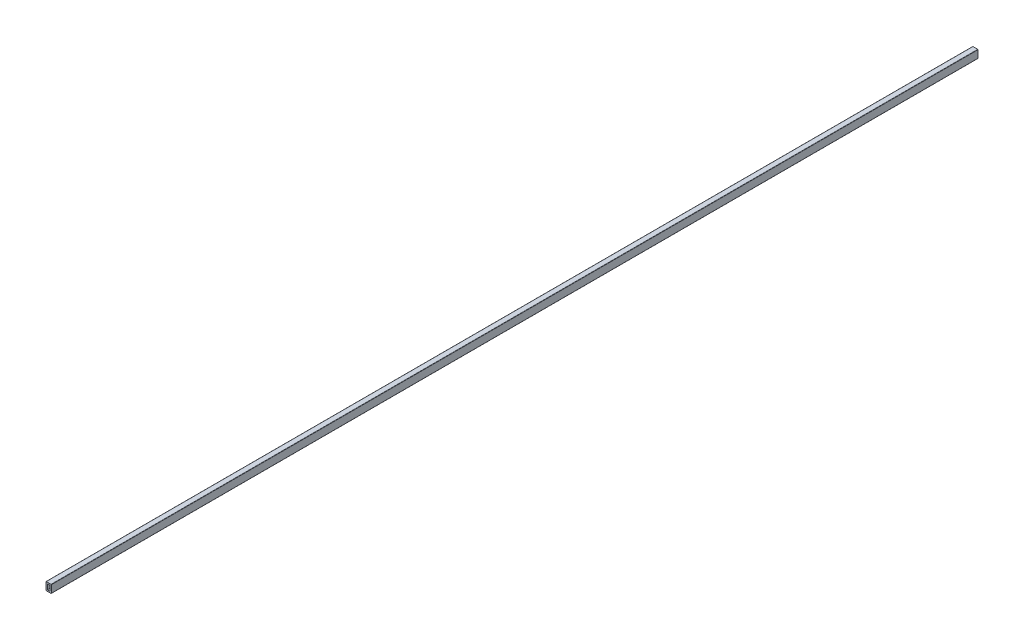
ISO-10303-21;
HEADER;
FILE_DESCRIPTION(('STEP AP214'),'2;1');
FILE_NAME('part.step','',(''),(''),'','','');
FILE_SCHEMA(('AUTOMOTIVE_DESIGN { 1 0 10303 214 1 1 1 1 }'));
ENDSEC;
DATA;
#1=APPLICATION_CONTEXT('core data for automotive mechanical design processes');
#2=APPLICATION_PROTOCOL_DEFINITION('international standard','automotive_design',2000,#1);
#3=PRODUCT_CONTEXT('',#1,'mechanical');
#4=PRODUCT('Part','Part','',(#3));
#5=PRODUCT_RELATED_PRODUCT_CATEGORY('part','',(#4));
#6=PRODUCT_DEFINITION_FORMATION('','',#4);
#7=PRODUCT_DEFINITION_CONTEXT('part definition',#1,'design');
#8=PRODUCT_DEFINITION('design','',#6,#7);
#9=PRODUCT_DEFINITION_SHAPE('','',#8);
#10=(LENGTH_UNIT() NAMED_UNIT(*) SI_UNIT(.MILLI.,.METRE.));
#11=(NAMED_UNIT(*) PLANE_ANGLE_UNIT() SI_UNIT($,.RADIAN.));
#12=(NAMED_UNIT(*) SI_UNIT($,.STERADIAN.) SOLID_ANGLE_UNIT());
#13=UNCERTAINTY_MEASURE_WITH_UNIT(LENGTH_MEASURE(1.E-05),#10,'distance_accuracy_value','');
#14=(GEOMETRIC_REPRESENTATION_CONTEXT(3) GLOBAL_UNCERTAINTY_ASSIGNED_CONTEXT((#13)) GLOBAL_UNIT_ASSIGNED_CONTEXT((#10,
#11,#12)) REPRESENTATION_CONTEXT('',''));
#15=CARTESIAN_POINT('',(0.,0.,0.));
#16=DIRECTION('',(0.,0.,1.));
#17=DIRECTION('',(1.,0.,0.));
#18=AXIS2_PLACEMENT_3D('',#15,#16,#17);
#19=CARTESIAN_POINT('',(0.9,-1.4,0.));
#20=DIRECTION('',(0.,0.,1.));
#21=DIRECTION('',(1.,0.,0.));
#22=AXIS2_PLACEMENT_3D('',#19,#20,#21);
#23=CYLINDRICAL_SURFACE('',#22,0.1);
#24=DIRECTION('',(0.,0.,-1.));
#25=VECTOR('',#24,1.);
#26=CARTESIAN_POINT('',(0.9,-1.5,0.));
#27=LINE('',#26,#25);
#28=CARTESIAN_POINT('',(0.9,-1.5,350.));
#29=VERTEX_POINT('',#28);
#30=CARTESIAN_POINT('',(0.9,-1.5,0.));
#31=VERTEX_POINT('',#30);
#32=EDGE_CURVE('E115',#29,#31,#27,.T.);
#33=ORIENTED_EDGE('',*,*,#32,.T.);
#34=CARTESIAN_POINT('',(0.9,-1.4,0.));
#35=DIRECTION('',(0.,0.,1.));
#36=DIRECTION('',(1.,0.,0.));
#37=AXIS2_PLACEMENT_3D('',#34,#35,#36);
#38=CIRCLE('',#37,0.1);
#39=CARTESIAN_POINT('',(1.,-1.4,0.));
#40=VERTEX_POINT('',#39);
#41=EDGE_CURVE('E20',#40,#31,#38,.F.);
#42=ORIENTED_EDGE('',*,*,#41,.F.);
#43=DIRECTION('',(0.,0.,-1.));
#44=VECTOR('',#43,1.);
#45=CARTESIAN_POINT('',(1.,-1.4,0.));
#46=LINE('',#45,#44);
#47=CARTESIAN_POINT('',(1.,-1.4,350.));
#48=VERTEX_POINT('',#47);
#49=EDGE_CURVE('E120',#40,#48,#46,.F.);
#50=ORIENTED_EDGE('',*,*,#49,.T.);
#51=CARTESIAN_POINT('',(0.9,-1.4,350.));
#52=DIRECTION('',(0.,0.,1.));
#53=DIRECTION('',(1.,0.,0.));
#54=AXIS2_PLACEMENT_3D('',#51,#52,#53);
#55=CIRCLE('',#54,0.1);
#56=EDGE_CURVE('E113',#29,#48,#55,.T.);
#57=ORIENTED_EDGE('',*,*,#56,.F.);
#58=EDGE_LOOP('',(#33,#42,#50,#57));
#59=FACE_BOUND('',#58,.T.);
#60=ADVANCED_FACE('F17',(#59),#23,.T.);
#61=CARTESIAN_POINT('',(-0.9,-1.4,0.));
#62=DIRECTION('',(0.,0.,1.));
#63=DIRECTION('',(1.,0.,0.));
#64=AXIS2_PLACEMENT_3D('',#61,#62,#63);
#65=CYLINDRICAL_SURFACE('',#64,0.0999999999999999);
#66=DIRECTION('',(0.,0.,1.));
#67=VECTOR('',#66,1.);
#68=CARTESIAN_POINT('',(-1.,-1.4,0.));
#69=LINE('',#68,#67);
#70=CARTESIAN_POINT('',(-1.,-1.4,350.));
#71=VERTEX_POINT('',#70);
#72=CARTESIAN_POINT('',(-1.,-1.4,0.));
#73=VERTEX_POINT('',#72);
#74=EDGE_CURVE('E144',#71,#73,#69,.F.);
#75=ORIENTED_EDGE('',*,*,#74,.T.);
#76=CARTESIAN_POINT('',(-0.9,-1.4,0.));
#77=DIRECTION('',(0.,0.,1.));
#78=DIRECTION('',(1.,0.,0.));
#79=AXIS2_PLACEMENT_3D('',#76,#77,#78);
#80=CIRCLE('',#79,0.0999999999999999);
#81=CARTESIAN_POINT('',(-0.9,-1.5,0.));
#82=VERTEX_POINT('',#81);
#83=EDGE_CURVE('E165',#82,#73,#80,.F.);
#84=ORIENTED_EDGE('',*,*,#83,.F.);
#85=DIRECTION('',(0.,0.,-1.));
#86=VECTOR('',#85,1.);
#87=CARTESIAN_POINT('',(-0.9,-1.5,0.));
#88=LINE('',#87,#86);
#89=CARTESIAN_POINT('',(-0.9,-1.5,350.));
#90=VERTEX_POINT('',#89);
#91=EDGE_CURVE('E119',#82,#90,#88,.F.);
#92=ORIENTED_EDGE('',*,*,#91,.T.);
#93=CARTESIAN_POINT('',(-0.9,-1.4,350.));
#94=DIRECTION('',(0.,0.,1.));
#95=DIRECTION('',(1.,0.,0.));
#96=AXIS2_PLACEMENT_3D('',#93,#94,#95);
#97=CIRCLE('',#96,0.0999999999999999);
#98=EDGE_CURVE('E163',#71,#90,#97,.T.);
#99=ORIENTED_EDGE('',*,*,#98,.F.);
#100=EDGE_LOOP('',(#75,#84,#92,#99));
#101=FACE_BOUND('',#100,.T.);
#102=ADVANCED_FACE('F227',(#101),#65,.T.);
#103=CARTESIAN_POINT('',(0.9,1.4,0.));
#104=DIRECTION('',(0.,0.,1.));
#105=DIRECTION('',(1.,0.,0.));
#106=AXIS2_PLACEMENT_3D('',#103,#104,#105);
#107=CYLINDRICAL_SURFACE('',#106,0.0999999999999999);
#108=DIRECTION('',(0.,0.,-1.));
#109=VECTOR('',#108,1.);
#110=CARTESIAN_POINT('',(1.,1.4,0.));
#111=LINE('',#110,#109);
#112=CARTESIAN_POINT('',(1.,1.4,350.));
#113=VERTEX_POINT('',#112);
#114=CARTESIAN_POINT('',(1.,1.4,0.));
#115=VERTEX_POINT('',#114);
#116=EDGE_CURVE('E151',#113,#115,#111,.T.);
#117=ORIENTED_EDGE('',*,*,#116,.T.);
#118=CARTESIAN_POINT('',(0.9,1.4,0.));
#119=DIRECTION('',(0.,0.,1.));
#120=DIRECTION('',(1.,0.,0.));
#121=AXIS2_PLACEMENT_3D('',#118,#119,#120);
#122=CIRCLE('',#121,0.0999999999999999);
#123=CARTESIAN_POINT('',(0.9,1.5,0.));
#124=VERTEX_POINT('',#123);
#125=EDGE_CURVE('E161',#124,#115,#122,.F.);
#126=ORIENTED_EDGE('',*,*,#125,.F.);
#127=DIRECTION('',(0.,0.,1.));
#128=VECTOR('',#127,1.);
#129=CARTESIAN_POINT('',(0.9,1.5,0.));
#130=LINE('',#129,#128);
#131=CARTESIAN_POINT('',(0.9,1.5,350.));
#132=VERTEX_POINT('',#131);
#133=EDGE_CURVE('E141',#124,#132,#130,.T.);
#134=ORIENTED_EDGE('',*,*,#133,.T.);
#135=CARTESIAN_POINT('',(0.9,1.4,350.));
#136=DIRECTION('',(0.,0.,1.));
#137=DIRECTION('',(1.,0.,0.));
#138=AXIS2_PLACEMENT_3D('',#135,#136,#137);
#139=CIRCLE('',#138,0.0999999999999999);
#140=EDGE_CURVE('E159',#113,#132,#139,.T.);
#141=ORIENTED_EDGE('',*,*,#140,.F.);
#142=EDGE_LOOP('',(#117,#126,#134,#141));
#143=FACE_BOUND('',#142,.T.);
#144=ADVANCED_FACE('F229',(#143),#107,.T.);
#145=CARTESIAN_POINT('',(-0.9,1.4,0.));
#146=DIRECTION('',(0.,0.,1.));
#147=DIRECTION('',(1.,0.,0.));
#148=AXIS2_PLACEMENT_3D('',#145,#146,#147);
#149=CYLINDRICAL_SURFACE('',#148,0.1);
#150=DIRECTION('',(0.,0.,1.));
#151=VECTOR('',#150,1.);
#152=CARTESIAN_POINT('',(-0.9,1.5,0.));
#153=LINE('',#152,#151);
#154=CARTESIAN_POINT('',(-0.9,1.5,350.));
#155=VERTEX_POINT('',#154);
#156=CARTESIAN_POINT('',(-0.9,1.5,0.));
#157=VERTEX_POINT('',#156);
#158=EDGE_CURVE('E138',#155,#157,#153,.F.);
#159=ORIENTED_EDGE('',*,*,#158,.T.);
#160=CARTESIAN_POINT('',(-0.9,1.4,0.));
#161=DIRECTION('',(0.,0.,1.));
#162=DIRECTION('',(1.,0.,0.));
#163=AXIS2_PLACEMENT_3D('',#160,#161,#162);
#164=CIRCLE('',#163,0.1);
#165=CARTESIAN_POINT('',(-1.,1.4,0.));
#166=VERTEX_POINT('',#165);
#167=EDGE_CURVE('E157',#166,#157,#164,.F.);
#168=ORIENTED_EDGE('',*,*,#167,.F.);
#169=DIRECTION('',(0.,0.,1.));
#170=VECTOR('',#169,1.);
#171=CARTESIAN_POINT('',(-1.,1.4,0.));
#172=LINE('',#171,#170);
#173=CARTESIAN_POINT('',(-1.,1.4,350.));
#174=VERTEX_POINT('',#173);
#175=EDGE_CURVE('E147',#166,#174,#172,.T.);
#176=ORIENTED_EDGE('',*,*,#175,.T.);
#177=CARTESIAN_POINT('',(-0.9,1.4,350.));
#178=DIRECTION('',(0.,0.,1.));
#179=DIRECTION('',(1.,0.,0.));
#180=AXIS2_PLACEMENT_3D('',#177,#178,#179);
#181=CIRCLE('',#180,0.1);
#182=EDGE_CURVE('E154',#155,#174,#181,.T.);
#183=ORIENTED_EDGE('',*,*,#182,.F.);
#184=EDGE_LOOP('',(#159,#168,#176,#183));
#185=FACE_BOUND('',#184,.T.);
#186=ADVANCED_FACE('F224',(#185),#149,.T.);
#187=CARTESIAN_POINT('',(1.,0.,0.));
#188=DIRECTION('',(1.,0.,0.));
#189=DIRECTION('',(0.,0.,-1.));
#190=AXIS2_PLACEMENT_3D('',#187,#188,#189);
#191=PLANE('',#190);
#192=ORIENTED_EDGE('',*,*,#49,.F.);
#193=DIRECTION('',(0.,1.,0.));
#194=VECTOR('',#193,1.);
#195=CARTESIAN_POINT('',(1.,0.,0.));
#196=LINE('',#195,#194);
#197=EDGE_CURVE('E112',#40,#115,#196,.T.);
#198=ORIENTED_EDGE('',*,*,#197,.T.);
#199=ORIENTED_EDGE('',*,*,#116,.F.);
#200=DIRECTION('',(0.,1.,0.));
#201=VECTOR('',#200,1.);
#202=CARTESIAN_POINT('',(1.,0.,350.));
#203=LINE('',#202,#201);
#204=EDGE_CURVE('E170',#113,#48,#203,.F.);
#205=ORIENTED_EDGE('',*,*,#204,.T.);
#206=EDGE_LOOP('',(#192,#198,#199,#205));
#207=FACE_BOUND('',#206,.T.);
#208=ADVANCED_FACE('F174',(#207),#191,.T.);
#209=CARTESIAN_POINT('',(0.,-1.5,0.));
#210=DIRECTION('',(0.,-1.,0.));
#211=DIRECTION('',(0.,0.,-1.));
#212=AXIS2_PLACEMENT_3D('',#209,#210,#211);
#213=PLANE('',#212);
#214=ORIENTED_EDGE('',*,*,#91,.F.);
#215=DIRECTION('',(1.,0.,0.));
#216=VECTOR('',#215,1.);
#217=CARTESIAN_POINT('',(0.,-1.5,0.));
#218=LINE('',#217,#216);
#219=EDGE_CURVE('E110',#82,#31,#218,.T.);
#220=ORIENTED_EDGE('',*,*,#219,.T.);
#221=ORIENTED_EDGE('',*,*,#32,.F.);
#222=DIRECTION('',(1.,0.,0.));
#223=VECTOR('',#222,1.);
#224=CARTESIAN_POINT('',(0.,-1.5,350.));
#225=LINE('',#224,#223);
#226=EDGE_CURVE('E171',#29,#90,#225,.F.);
#227=ORIENTED_EDGE('',*,*,#226,.T.);
#228=EDGE_LOOP('',(#214,#220,#221,#227));
#229=FACE_BOUND('',#228,.T.);
#230=ADVANCED_FACE('F123',(#229),#213,.T.);
#231=CARTESIAN_POINT('',(-1.,0.,0.));
#232=DIRECTION('',(-1.,0.,0.));
#233=DIRECTION('',(0.,0.,1.));
#234=AXIS2_PLACEMENT_3D('',#231,#232,#233);
#235=PLANE('',#234);
#236=ORIENTED_EDGE('',*,*,#74,.F.);
#237=DIRECTION('',(0.,1.,0.));
#238=VECTOR('',#237,1.);
#239=CARTESIAN_POINT('',(-1.,0.,350.));
#240=LINE('',#239,#238);
#241=EDGE_CURVE('E177',#71,#174,#240,.T.);
#242=ORIENTED_EDGE('',*,*,#241,.T.);
#243=ORIENTED_EDGE('',*,*,#175,.F.);
#244=DIRECTION('',(0.,1.,0.));
#245=VECTOR('',#244,1.);
#246=CARTESIAN_POINT('',(-1.,0.,0.));
#247=LINE('',#246,#245);
#248=EDGE_CURVE('E125',#166,#73,#247,.F.);
#249=ORIENTED_EDGE('',*,*,#248,.T.);
#250=EDGE_LOOP('',(#236,#242,#243,#249));
#251=FACE_BOUND('',#250,.T.);
#252=ADVANCED_FACE('F219',(#251),#235,.T.);
#253=CARTESIAN_POINT('',(0.,1.5,0.));
#254=DIRECTION('',(0.,1.,0.));
#255=DIRECTION('',(0.,0.,1.));
#256=AXIS2_PLACEMENT_3D('',#253,#254,#255);
#257=PLANE('',#256);
#258=ORIENTED_EDGE('',*,*,#158,.F.);
#259=DIRECTION('',(1.,0.,0.));
#260=VECTOR('',#259,1.);
#261=CARTESIAN_POINT('',(0.,1.5,350.));
#262=LINE('',#261,#260);
#263=EDGE_CURVE('E212',#155,#132,#262,.T.);
#264=ORIENTED_EDGE('',*,*,#263,.T.);
#265=ORIENTED_EDGE('',*,*,#133,.F.);
#266=DIRECTION('',(1.,0.,0.));
#267=VECTOR('',#266,1.);
#268=CARTESIAN_POINT('',(0.,1.5,0.));
#269=LINE('',#268,#267);
#270=EDGE_CURVE('E130',#124,#157,#269,.F.);
#271=ORIENTED_EDGE('',*,*,#270,.T.);
#272=EDGE_LOOP('',(#258,#264,#265,#271));
#273=FACE_BOUND('',#272,.T.);
#274=ADVANCED_FACE('F255',(#273),#257,.T.);
#275=CARTESIAN_POINT('',(0.5,0.,0.));
#276=DIRECTION('',(1.,0.,0.));
#277=DIRECTION('',(0.,0.,-1.));
#278=AXIS2_PLACEMENT_3D('',#275,#276,#277);
#279=PLANE('',#278);
#280=DIRECTION('',(0.,0.,1.));
#281=VECTOR('',#280,1.);
#282=CARTESIAN_POINT('',(0.5,1.,0.));
#283=LINE('',#282,#281);
#284=CARTESIAN_POINT('',(0.5,1.,350.));
#285=VERTEX_POINT('',#284);
#286=CARTESIAN_POINT('',(0.5,1.,0.));
#287=VERTEX_POINT('',#286);
#288=EDGE_CURVE('E136',#285,#287,#283,.F.);
#289=ORIENTED_EDGE('',*,*,#288,.T.);
#290=DIRECTION('',(0.,1.,0.));
#291=VECTOR('',#290,1.);
#292=CARTESIAN_POINT('',(0.5,0.,0.));
#293=LINE('',#292,#291);
#294=CARTESIAN_POINT('',(0.5,-1.,0.));
#295=VERTEX_POINT('',#294);
#296=EDGE_CURVE('E185',#287,#295,#293,.F.);
#297=ORIENTED_EDGE('',*,*,#296,.T.);
#298=DIRECTION('',(0.,0.,-1.));
#299=VECTOR('',#298,1.);
#300=CARTESIAN_POINT('',(0.5,-1.,0.));
#301=LINE('',#300,#299);
#302=CARTESIAN_POINT('',(0.5,-1.,350.));
#303=VERTEX_POINT('',#302);
#304=EDGE_CURVE('E175',#295,#303,#301,.F.);
#305=ORIENTED_EDGE('',*,*,#304,.T.);
#306=DIRECTION('',(0.,1.,0.));
#307=VECTOR('',#306,1.);
#308=CARTESIAN_POINT('',(0.5,0.,350.));
#309=LINE('',#308,#307);
#310=EDGE_CURVE('E208',#303,#285,#309,.T.);
#311=ORIENTED_EDGE('',*,*,#310,.T.);
#312=EDGE_LOOP('',(#289,#297,#305,#311));
#313=FACE_BOUND('',#312,.T.);
#314=ADVANCED_FACE('F252',(#313),#279,.F.);
#315=CARTESIAN_POINT('',(0.,1.,0.));
#316=DIRECTION('',(0.,1.,0.));
#317=DIRECTION('',(0.,0.,1.));
#318=AXIS2_PLACEMENT_3D('',#315,#316,#317);
#319=PLANE('',#318);
#320=DIRECTION('',(0.,0.,1.));
#321=VECTOR('',#320,1.);
#322=CARTESIAN_POINT('',(-0.5,1.,0.));
#323=LINE('',#322,#321);
#324=CARTESIAN_POINT('',(-0.5,1.,350.));
#325=VERTEX_POINT('',#324);
#326=CARTESIAN_POINT('',(-0.5,1.,0.));
#327=VERTEX_POINT('',#326);
#328=EDGE_CURVE('E192',#325,#327,#323,.F.);
#329=ORIENTED_EDGE('',*,*,#328,.T.);
#330=DIRECTION('',(1.,0.,0.));
#331=VECTOR('',#330,1.);
#332=CARTESIAN_POINT('',(0.,1.,0.));
#333=LINE('',#332,#331);
#334=EDGE_CURVE('E127',#327,#287,#333,.T.);
#335=ORIENTED_EDGE('',*,*,#334,.T.);
#336=ORIENTED_EDGE('',*,*,#288,.F.);
#337=DIRECTION('',(1.,0.,0.));
#338=VECTOR('',#337,1.);
#339=CARTESIAN_POINT('',(0.,1.,350.));
#340=LINE('',#339,#338);
#341=EDGE_CURVE('E204',#285,#325,#340,.F.);
#342=ORIENTED_EDGE('',*,*,#341,.T.);
#343=EDGE_LOOP('',(#329,#335,#336,#342));
#344=FACE_BOUND('',#343,.T.);
#345=ADVANCED_FACE('F189',(#344),#319,.F.);
#346=CARTESIAN_POINT('',(0.,0.,0.));
#347=DIRECTION('',(0.,0.,1.));
#348=DIRECTION('',(1.,0.,0.));
#349=AXIS2_PLACEMENT_3D('',#346,#347,#348);
#350=PLANE('',#349);
#351=ORIENTED_EDGE('',*,*,#296,.F.);
#352=ORIENTED_EDGE('',*,*,#334,.F.);
#353=DIRECTION('',(0.,1.,0.));
#354=VECTOR('',#353,1.);
#355=CARTESIAN_POINT('',(-0.5,0.,0.));
#356=LINE('',#355,#354);
#357=CARTESIAN_POINT('',(-0.5,-1.,0.));
#358=VERTEX_POINT('',#357);
#359=EDGE_CURVE('E197',#327,#358,#356,.F.);
#360=ORIENTED_EDGE('',*,*,#359,.T.);
#361=DIRECTION('',(1.,0.,0.));
#362=VECTOR('',#361,1.);
#363=CARTESIAN_POINT('',(0.,-1.,0.));
#364=LINE('',#363,#362);
#365=EDGE_CURVE('E179',#358,#295,#364,.T.);
#366=ORIENTED_EDGE('',*,*,#365,.T.);
#367=EDGE_LOOP('',(#351,#352,#360,#366));
#368=FACE_BOUND('',#367,.T.);
#369=ORIENTED_EDGE('',*,*,#197,.F.);
#370=ORIENTED_EDGE('',*,*,#41,.T.);
#371=ORIENTED_EDGE('',*,*,#219,.F.);
#372=ORIENTED_EDGE('',*,*,#83,.T.);
#373=ORIENTED_EDGE('',*,*,#248,.F.);
#374=ORIENTED_EDGE('',*,*,#167,.T.);
#375=ORIENTED_EDGE('',*,*,#270,.F.);
#376=ORIENTED_EDGE('',*,*,#125,.T.);
#377=EDGE_LOOP('',(#369,#370,#371,#372,#373,#374,#375,#376));
#378=FACE_BOUND('',#377,.T.);
#379=ADVANCED_FACE('F108',(#368,#378),#350,.F.);
#380=CARTESIAN_POINT('',(0.,-1.,0.));
#381=DIRECTION('',(0.,-1.,0.));
#382=DIRECTION('',(0.,0.,-1.));
#383=AXIS2_PLACEMENT_3D('',#380,#381,#382);
#384=PLANE('',#383);
#385=ORIENTED_EDGE('',*,*,#304,.F.);
#386=ORIENTED_EDGE('',*,*,#365,.F.);
#387=DIRECTION('',(0.,0.,1.));
#388=VECTOR('',#387,1.);
#389=CARTESIAN_POINT('',(-0.5,-1.,0.));
#390=LINE('',#389,#388);
#391=CARTESIAN_POINT('',(-0.5,-1.,350.));
#392=VERTEX_POINT('',#391);
#393=EDGE_CURVE('E26',#358,#392,#390,.T.);
#394=ORIENTED_EDGE('',*,*,#393,.T.);
#395=DIRECTION('',(1.,0.,0.));
#396=VECTOR('',#395,1.);
#397=CARTESIAN_POINT('',(0.,-1.,350.));
#398=LINE('',#397,#396);
#399=EDGE_CURVE('E34',#392,#303,#398,.T.);
#400=ORIENTED_EDGE('',*,*,#399,.T.);
#401=EDGE_LOOP('',(#385,#386,#394,#400));
#402=FACE_BOUND('',#401,.T.);
#403=ADVANCED_FACE('F242',(#402),#384,.F.);
#404=CARTESIAN_POINT('',(0.,0.,350.));
#405=DIRECTION('',(0.,0.,1.));
#406=DIRECTION('',(1.,0.,0.));
#407=AXIS2_PLACEMENT_3D('',#404,#405,#406);
#408=PLANE('',#407);
#409=ORIENTED_EDGE('',*,*,#341,.F.);
#410=ORIENTED_EDGE('',*,*,#310,.F.);
#411=ORIENTED_EDGE('',*,*,#399,.F.);
#412=DIRECTION('',(0.,1.,0.));
#413=VECTOR('',#412,1.);
#414=CARTESIAN_POINT('',(-0.5,0.,350.));
#415=LINE('',#414,#413);
#416=EDGE_CURVE('E11',#392,#325,#415,.T.);
#417=ORIENTED_EDGE('',*,*,#416,.T.);
#418=EDGE_LOOP('',(#409,#410,#411,#417));
#419=FACE_BOUND('',#418,.T.);
#420=ORIENTED_EDGE('',*,*,#182,.T.);
#421=ORIENTED_EDGE('',*,*,#241,.F.);
#422=ORIENTED_EDGE('',*,*,#98,.T.);
#423=ORIENTED_EDGE('',*,*,#226,.F.);
#424=ORIENTED_EDGE('',*,*,#56,.T.);
#425=ORIENTED_EDGE('',*,*,#204,.F.);
#426=ORIENTED_EDGE('',*,*,#140,.T.);
#427=ORIENTED_EDGE('',*,*,#263,.F.);
#428=EDGE_LOOP('',(#420,#421,#422,#423,#424,#425,#426,#427));
#429=FACE_BOUND('',#428,.T.);
#430=ADVANCED_FACE('F168',(#419,#429),#408,.T.);
#431=CARTESIAN_POINT('',(-0.5,0.,0.));
#432=DIRECTION('',(-1.,0.,0.));
#433=DIRECTION('',(0.,0.,1.));
#434=AXIS2_PLACEMENT_3D('',#431,#432,#433);
#435=PLANE('',#434);
#436=ORIENTED_EDGE('',*,*,#393,.F.);
#437=ORIENTED_EDGE('',*,*,#359,.F.);
#438=ORIENTED_EDGE('',*,*,#328,.F.);
#439=ORIENTED_EDGE('',*,*,#416,.F.);
#440=EDGE_LOOP('',(#436,#437,#438,#439));
#441=FACE_BOUND('',#440,.T.);
#442=ADVANCED_FACE('F200',(#441),#435,.F.);
#443=CLOSED_SHELL('',(#60,#102,#144,#186,#208,#230,#252,#274,#314,#345,#379,#403,#430,#442));
#444=MANIFOLD_SOLID_BREP('B1',#443);
#445=ADVANCED_BREP_SHAPE_REPRESENTATION('',(#18,#444),#14);
#446=SHAPE_DEFINITION_REPRESENTATION(#9,#445);
ENDSEC;
END-ISO-10303-21;
